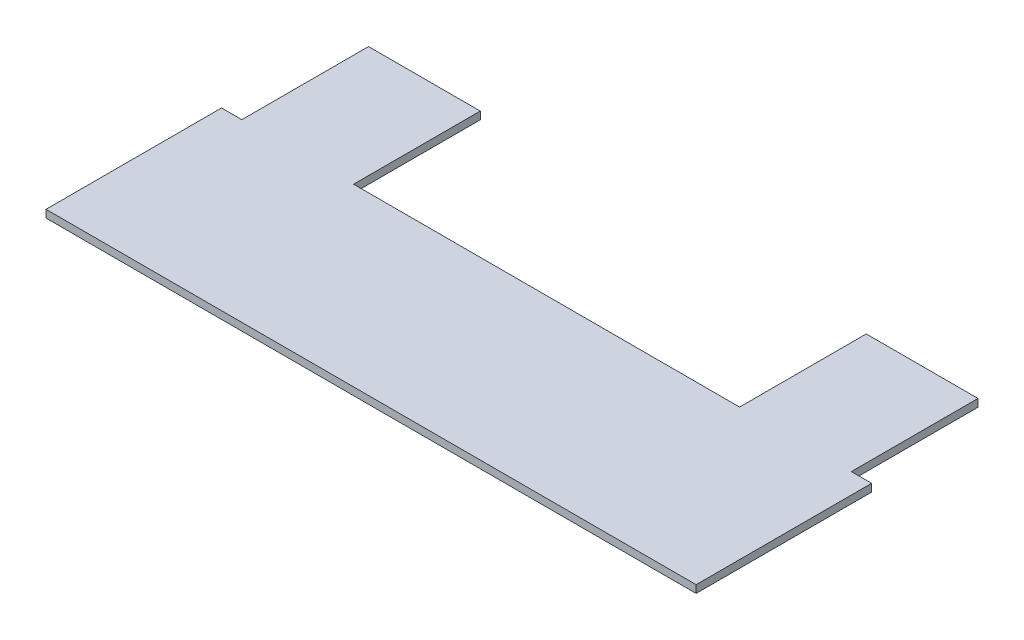
ISO-10303-21;
HEADER;
FILE_DESCRIPTION(('STEP AP214'),'2;1');
FILE_NAME('part.step','',(''),(''),'','','');
FILE_SCHEMA(('AUTOMOTIVE_DESIGN { 1 0 10303 214 1 1 1 1 }'));
ENDSEC;
DATA;
#1=APPLICATION_CONTEXT('core data for automotive mechanical design processes');
#2=APPLICATION_PROTOCOL_DEFINITION('international standard','automotive_design',2000,#1);
#3=PRODUCT_CONTEXT('',#1,'mechanical');
#4=PRODUCT('Part','Part','',(#3));
#5=PRODUCT_RELATED_PRODUCT_CATEGORY('part','',(#4));
#6=PRODUCT_DEFINITION_FORMATION('','',#4);
#7=PRODUCT_DEFINITION_CONTEXT('part definition',#1,'design');
#8=PRODUCT_DEFINITION('design','',#6,#7);
#9=PRODUCT_DEFINITION_SHAPE('','',#8);
#10=(LENGTH_UNIT() NAMED_UNIT(*) SI_UNIT(.MILLI.,.METRE.));
#11=(NAMED_UNIT(*) PLANE_ANGLE_UNIT() SI_UNIT($,.RADIAN.));
#12=(NAMED_UNIT(*) SI_UNIT($,.STERADIAN.) SOLID_ANGLE_UNIT());
#13=UNCERTAINTY_MEASURE_WITH_UNIT(LENGTH_MEASURE(1.E-05),#10,'distance_accuracy_value','');
#14=(GEOMETRIC_REPRESENTATION_CONTEXT(3) GLOBAL_UNCERTAINTY_ASSIGNED_CONTEXT((#13)) GLOBAL_UNIT_ASSIGNED_CONTEXT((#10,
#11,#12)) REPRESENTATION_CONTEXT('',''));
#15=CARTESIAN_POINT('',(0.,0.,0.));
#16=DIRECTION('',(0.,0.,1.));
#17=DIRECTION('',(1.,0.,0.));
#18=AXIS2_PLACEMENT_3D('',#15,#16,#17);
#19=CARTESIAN_POINT('',(-203.2,4.7625,-94.45625));
#20=DIRECTION('',(0.,0.,1.));
#21=DIRECTION('',(1.,0.,0.));
#22=AXIS2_PLACEMENT_3D('',#19,#20,#21);
#23=PLANE('',#22);
#24=DIRECTION('',(-1.,0.,0.));
#25=VECTOR('',#24,1.);
#26=CARTESIAN_POINT('',(-203.2,0.,-94.45625));
#27=LINE('',#26,#25);
#28=CARTESIAN_POINT('',(-120.65,0.,-94.45625));
#29=VERTEX_POINT('',#28);
#30=CARTESIAN_POINT('',(-190.5,0.,-94.45625));
#31=VERTEX_POINT('',#30);
#32=EDGE_CURVE('E239',#29,#31,#27,.T.);
#33=ORIENTED_EDGE('',*,*,#32,.T.);
#34=DIRECTION('',(0.,1.,0.));
#35=VECTOR('',#34,1.);
#36=CARTESIAN_POINT('',(-190.5,-253.959588890519,-94.45625));
#37=LINE('',#36,#35);
#38=CARTESIAN_POINT('',(-190.5,4.7625,-94.45625));
#39=VERTEX_POINT('',#38);
#40=EDGE_CURVE('E54',#31,#39,#37,.T.);
#41=ORIENTED_EDGE('',*,*,#40,.T.);
#42=DIRECTION('',(-1.,0.,0.));
#43=VECTOR('',#42,1.);
#44=CARTESIAN_POINT('',(-203.2,4.7625,-94.45625));
#45=LINE('',#44,#43);
#46=CARTESIAN_POINT('',(-120.65,4.7625,-94.45625));
#47=VERTEX_POINT('',#46);
#48=EDGE_CURVE('E224',#47,#39,#45,.T.);
#49=ORIENTED_EDGE('',*,*,#48,.F.);
#50=DIRECTION('',(0.,1.,0.));
#51=VECTOR('',#50,1.);
#52=CARTESIAN_POINT('',(-120.65,-253.959588890519,-94.45625));
#53=LINE('',#52,#51);
#54=EDGE_CURVE('E191',#29,#47,#53,.T.);
#55=ORIENTED_EDGE('',*,*,#54,.F.);
#56=EDGE_LOOP('',(#33,#41,#49,#55));
#57=FACE_BOUND('',#56,.T.);
#58=ADVANCED_FACE('F38',(#57),#23,.F.);
#59=CARTESIAN_POINT('',(203.2,4.7625,94.45625));
#60=DIRECTION('',(-1.,0.,0.));
#61=DIRECTION('',(0.,0.,1.));
#62=AXIS2_PLACEMENT_3D('',#59,#60,#61);
#63=PLANE('',#62);
#64=DIRECTION('',(0.,0.,-1.));
#65=VECTOR('',#64,1.);
#66=CARTESIAN_POINT('',(203.2,0.,94.45625));
#67=LINE('',#66,#65);
#68=CARTESIAN_POINT('',(203.2,0.,94.45625));
#69=VERTEX_POINT('',#68);
#70=CARTESIAN_POINT('',(203.2,0.,-15.27429));
#71=VERTEX_POINT('',#70);
#72=EDGE_CURVE('E161',#69,#71,#67,.T.);
#73=ORIENTED_EDGE('',*,*,#72,.T.);
#74=DIRECTION('',(0.,1.,0.));
#75=VECTOR('',#74,1.);
#76=CARTESIAN_POINT('',(203.2,-253.959588890519,-15.27429));
#77=LINE('',#76,#75);
#78=CARTESIAN_POINT('',(203.2,4.7625,-15.27429));
#79=VERTEX_POINT('',#78);
#80=EDGE_CURVE('E174',#71,#79,#77,.T.);
#81=ORIENTED_EDGE('',*,*,#80,.T.);
#82=DIRECTION('',(0.,0.,-1.));
#83=VECTOR('',#82,1.);
#84=CARTESIAN_POINT('',(203.2,4.7625,94.45625));
#85=LINE('',#84,#83);
#86=CARTESIAN_POINT('',(203.2,4.7625,94.45625));
#87=VERTEX_POINT('',#86);
#88=EDGE_CURVE('E220',#87,#79,#85,.T.);
#89=ORIENTED_EDGE('',*,*,#88,.F.);
#90=DIRECTION('',(0.,-1.,0.));
#91=VECTOR('',#90,1.);
#92=CARTESIAN_POINT('',(203.2,4.7625,94.45625));
#93=LINE('',#92,#91);
#94=EDGE_CURVE('E47',#87,#69,#93,.T.);
#95=ORIENTED_EDGE('',*,*,#94,.T.);
#96=EDGE_LOOP('',(#73,#81,#89,#95));
#97=FACE_BOUND('',#96,.T.);
#98=ADVANCED_FACE('F40',(#97),#63,.F.);
#99=CARTESIAN_POINT('',(190.5,4.7625,-94.45625));
#100=VERTEX_POINT('',#99);
#101=CARTESIAN_POINT('',(120.65,4.7625,-94.45625));
#102=VERTEX_POINT('',#101);
#103=EDGE_CURVE('E229',#100,#102,#45,.T.);
#104=ORIENTED_EDGE('',*,*,#103,.F.);
#105=DIRECTION('',(0.,1.,0.));
#106=VECTOR('',#105,1.);
#107=CARTESIAN_POINT('',(190.5,-253.959588890519,-94.45625));
#108=LINE('',#107,#106);
#109=CARTESIAN_POINT('',(190.5,0.,-94.45625));
#110=VERTEX_POINT('',#109);
#111=EDGE_CURVE('E165',#110,#100,#108,.T.);
#112=ORIENTED_EDGE('',*,*,#111,.F.);
#113=CARTESIAN_POINT('',(120.65,0.,-94.45625));
#114=VERTEX_POINT('',#113);
#115=EDGE_CURVE('E242',#110,#114,#27,.T.);
#116=ORIENTED_EDGE('',*,*,#115,.T.);
#117=DIRECTION('',(0.,1.,0.));
#118=VECTOR('',#117,1.);
#119=CARTESIAN_POINT('',(120.65,-253.959588890519,-94.45625));
#120=LINE('',#119,#118);
#121=EDGE_CURVE('E62',#114,#102,#120,.T.);
#122=ORIENTED_EDGE('',*,*,#121,.T.);
#123=EDGE_LOOP('',(#104,#112,#116,#122));
#124=FACE_BOUND('',#123,.T.);
#125=ADVANCED_FACE('F288',(#124),#23,.F.);
#126=CARTESIAN_POINT('',(-203.2,4.7625,94.45625));
#127=DIRECTION('',(1.,0.,0.));
#128=DIRECTION('',(0.,0.,-1.));
#129=AXIS2_PLACEMENT_3D('',#126,#127,#128);
#130=PLANE('',#129);
#131=DIRECTION('',(0.,0.,1.));
#132=VECTOR('',#131,1.);
#133=CARTESIAN_POINT('',(-203.2,4.7625,94.45625));
#134=LINE('',#133,#132);
#135=CARTESIAN_POINT('',(-203.2,4.7625,-15.27429));
#136=VERTEX_POINT('',#135);
#137=CARTESIAN_POINT('',(-203.2,4.7625,94.45625));
#138=VERTEX_POINT('',#137);
#139=EDGE_CURVE('E230',#136,#138,#134,.T.);
#140=ORIENTED_EDGE('',*,*,#139,.F.);
#141=DIRECTION('',(0.,1.,0.));
#142=VECTOR('',#141,1.);
#143=CARTESIAN_POINT('',(-203.2,-253.959588890519,-15.27429));
#144=LINE('',#143,#142);
#145=CARTESIAN_POINT('',(-203.2,0.,-15.27429));
#146=VERTEX_POINT('',#145);
#147=EDGE_CURVE('E157',#146,#136,#144,.T.);
#148=ORIENTED_EDGE('',*,*,#147,.F.);
#149=DIRECTION('',(0.,0.,1.));
#150=VECTOR('',#149,1.);
#151=CARTESIAN_POINT('',(-203.2,0.,94.45625));
#152=LINE('',#151,#150);
#153=CARTESIAN_POINT('',(-203.2,0.,94.45625));
#154=VERTEX_POINT('',#153);
#155=EDGE_CURVE('E148',#146,#154,#152,.T.);
#156=ORIENTED_EDGE('',*,*,#155,.T.);
#157=DIRECTION('',(0.,-1.,0.));
#158=VECTOR('',#157,1.);
#159=CARTESIAN_POINT('',(-203.2,4.7625,94.45625));
#160=LINE('',#159,#158);
#161=EDGE_CURVE('E11',#138,#154,#160,.T.);
#162=ORIENTED_EDGE('',*,*,#161,.F.);
#163=EDGE_LOOP('',(#140,#148,#156,#162));
#164=FACE_BOUND('',#163,.T.);
#165=ADVANCED_FACE('F271',(#164),#130,.F.);
#166=CARTESIAN_POINT('',(-203.2,4.7625,94.45625));
#167=DIRECTION('',(0.,0.,-1.));
#168=DIRECTION('',(-1.,0.,0.));
#169=AXIS2_PLACEMENT_3D('',#166,#167,#168);
#170=PLANE('',#169);
#171=DIRECTION('',(1.,0.,0.));
#172=VECTOR('',#171,1.);
#173=CARTESIAN_POINT('',(-203.2,0.,94.45625));
#174=LINE('',#173,#172);
#175=EDGE_CURVE('E225',#154,#69,#174,.T.);
#176=ORIENTED_EDGE('',*,*,#175,.T.);
#177=ORIENTED_EDGE('',*,*,#94,.F.);
#178=DIRECTION('',(1.,0.,0.));
#179=VECTOR('',#178,1.);
#180=CARTESIAN_POINT('',(-203.2,4.7625,94.45625));
#181=LINE('',#180,#179);
#182=EDGE_CURVE('E233',#138,#87,#181,.T.);
#183=ORIENTED_EDGE('',*,*,#182,.F.);
#184=ORIENTED_EDGE('',*,*,#161,.T.);
#185=EDGE_LOOP('',(#176,#177,#183,#184));
#186=FACE_BOUND('',#185,.T.);
#187=ADVANCED_FACE('F269',(#186),#170,.F.);
#188=CARTESIAN_POINT('',(0.,4.7625,0.));
#189=DIRECTION('',(0.,-1.,0.));
#190=DIRECTION('',(0.,0.,-1.));
#191=AXIS2_PLACEMENT_3D('',#188,#189,#190);
#192=PLANE('',#191);
#193=DIRECTION('',(0.,0.,-1.));
#194=VECTOR('',#193,1.);
#195=CARTESIAN_POINT('',(-190.5,4.7625,-94.45625));
#196=LINE('',#195,#194);
#197=CARTESIAN_POINT('',(-190.5,4.7625,-15.27429));
#198=VERTEX_POINT('',#197);
#199=EDGE_CURVE('E150',#198,#39,#196,.T.);
#200=ORIENTED_EDGE('',*,*,#199,.F.);
#201=DIRECTION('',(1.,0.,0.));
#202=VECTOR('',#201,1.);
#203=CARTESIAN_POINT('',(-203.2,4.7625,-15.27429));
#204=LINE('',#203,#202);
#205=EDGE_CURVE('E141',#136,#198,#204,.T.);
#206=ORIENTED_EDGE('',*,*,#205,.F.);
#207=ORIENTED_EDGE('',*,*,#139,.T.);
#208=ORIENTED_EDGE('',*,*,#182,.T.);
#209=ORIENTED_EDGE('',*,*,#88,.T.);
#210=DIRECTION('',(1.,0.,0.));
#211=VECTOR('',#210,1.);
#212=CARTESIAN_POINT('',(203.2,4.7625,-15.27429));
#213=LINE('',#212,#211);
#214=CARTESIAN_POINT('',(190.5,4.7625,-15.27429));
#215=VERTEX_POINT('',#214);
#216=EDGE_CURVE('E162',#215,#79,#213,.T.);
#217=ORIENTED_EDGE('',*,*,#216,.F.);
#218=DIRECTION('',(0.,0.,1.));
#219=VECTOR('',#218,1.);
#220=CARTESIAN_POINT('',(190.5,4.7625,-94.45625));
#221=LINE('',#220,#219);
#222=EDGE_CURVE('E166',#100,#215,#221,.T.);
#223=ORIENTED_EDGE('',*,*,#222,.F.);
#224=ORIENTED_EDGE('',*,*,#103,.T.);
#225=DIRECTION('',(0.,0.,-1.));
#226=VECTOR('',#225,1.);
#227=CARTESIAN_POINT('',(120.65,4.7625,-15.27429));
#228=LINE('',#227,#226);
#229=CARTESIAN_POINT('',(120.65,4.7625,-15.27429));
#230=VERTEX_POINT('',#229);
#231=EDGE_CURVE('E196',#230,#102,#228,.T.);
#232=ORIENTED_EDGE('',*,*,#231,.F.);
#233=DIRECTION('',(1.,0.,0.));
#234=VECTOR('',#233,1.);
#235=CARTESIAN_POINT('',(-120.65,4.7625,-15.27429));
#236=LINE('',#235,#234);
#237=CARTESIAN_POINT('',(-120.65,4.7625,-15.27429));
#238=VERTEX_POINT('',#237);
#239=EDGE_CURVE('E187',#238,#230,#236,.T.);
#240=ORIENTED_EDGE('',*,*,#239,.F.);
#241=DIRECTION('',(0.,0.,1.));
#242=VECTOR('',#241,1.);
#243=CARTESIAN_POINT('',(-120.65,4.7625,-15.27429));
#244=LINE('',#243,#242);
#245=EDGE_CURVE('E192',#47,#238,#244,.T.);
#246=ORIENTED_EDGE('',*,*,#245,.F.);
#247=ORIENTED_EDGE('',*,*,#48,.T.);
#248=EDGE_LOOP('',(#200,#206,#207,#208,#209,#217,#223,#224,#232,#240,#246,#247));
#249=FACE_BOUND('',#248,.T.);
#250=ADVANCED_FACE('F266',(#249),#192,.F.);
#251=CARTESIAN_POINT('',(0.,0.,0.));
#252=DIRECTION('',(0.,-1.,0.));
#253=DIRECTION('',(0.,0.,-1.));
#254=AXIS2_PLACEMENT_3D('',#251,#252,#253);
#255=PLANE('',#254);
#256=DIRECTION('',(1.,0.,0.));
#257=VECTOR('',#256,1.);
#258=CARTESIAN_POINT('',(-203.2,0.,-15.27429));
#259=LINE('',#258,#257);
#260=CARTESIAN_POINT('',(-190.5,0.,-15.27429));
#261=VERTEX_POINT('',#260);
#262=EDGE_CURVE('E138',#146,#261,#259,.T.);
#263=ORIENTED_EDGE('',*,*,#262,.T.);
#264=DIRECTION('',(0.,0.,-1.));
#265=VECTOR('',#264,1.);
#266=CARTESIAN_POINT('',(-190.5,0.,-94.45625));
#267=LINE('',#266,#265);
#268=EDGE_CURVE('E125',#261,#31,#267,.T.);
#269=ORIENTED_EDGE('',*,*,#268,.T.);
#270=ORIENTED_EDGE('',*,*,#32,.F.);
#271=DIRECTION('',(0.,0.,1.));
#272=VECTOR('',#271,1.);
#273=CARTESIAN_POINT('',(-120.65,0.,-15.27429));
#274=LINE('',#273,#272);
#275=CARTESIAN_POINT('',(-120.65,0.,-15.27429));
#276=VERTEX_POINT('',#275);
#277=EDGE_CURVE('E208',#29,#276,#274,.T.);
#278=ORIENTED_EDGE('',*,*,#277,.T.);
#279=DIRECTION('',(1.,0.,0.));
#280=VECTOR('',#279,1.);
#281=CARTESIAN_POINT('',(-120.65,0.,-15.27429));
#282=LINE('',#281,#280);
#283=CARTESIAN_POINT('',(120.65,0.,-15.27429));
#284=VERTEX_POINT('',#283);
#285=EDGE_CURVE('E203',#276,#284,#282,.T.);
#286=ORIENTED_EDGE('',*,*,#285,.T.);
#287=DIRECTION('',(0.,0.,-1.));
#288=VECTOR('',#287,1.);
#289=CARTESIAN_POINT('',(120.65,0.,-15.27429));
#290=LINE('',#289,#288);
#291=EDGE_CURVE('E199',#284,#114,#290,.T.);
#292=ORIENTED_EDGE('',*,*,#291,.T.);
#293=ORIENTED_EDGE('',*,*,#115,.F.);
#294=DIRECTION('',(0.,0.,1.));
#295=VECTOR('',#294,1.);
#296=CARTESIAN_POINT('',(190.5,0.,-94.45625));
#297=LINE('',#296,#295);
#298=CARTESIAN_POINT('',(190.5,0.,-15.27429));
#299=VERTEX_POINT('',#298);
#300=EDGE_CURVE('E176',#110,#299,#297,.T.);
#301=ORIENTED_EDGE('',*,*,#300,.T.);
#302=DIRECTION('',(1.,0.,0.));
#303=VECTOR('',#302,1.);
#304=CARTESIAN_POINT('',(203.2,0.,-15.27429));
#305=LINE('',#304,#303);
#306=EDGE_CURVE('E170',#299,#71,#305,.T.);
#307=ORIENTED_EDGE('',*,*,#306,.T.);
#308=ORIENTED_EDGE('',*,*,#72,.F.);
#309=ORIENTED_EDGE('',*,*,#175,.F.);
#310=ORIENTED_EDGE('',*,*,#155,.F.);
#311=EDGE_LOOP('',(#263,#269,#270,#278,#286,#292,#293,#301,#307,#308,#309,#310));
#312=FACE_BOUND('',#311,.T.);
#313=ADVANCED_FACE('F146',(#312),#255,.T.);
#314=CARTESIAN_POINT('',(-120.65,-253.959588890519,-15.27429));
#315=DIRECTION('',(-1.,0.,0.));
#316=DIRECTION('',(0.,0.,1.));
#317=AXIS2_PLACEMENT_3D('',#314,#315,#316);
#318=PLANE('',#317);
#319=ORIENTED_EDGE('',*,*,#54,.T.);
#320=ORIENTED_EDGE('',*,*,#245,.T.);
#321=DIRECTION('',(0.,1.,0.));
#322=VECTOR('',#321,1.);
#323=CARTESIAN_POINT('',(-120.65,-253.959588890519,-15.27429));
#324=LINE('',#323,#322);
#325=EDGE_CURVE('E207',#276,#238,#324,.T.);
#326=ORIENTED_EDGE('',*,*,#325,.F.);
#327=ORIENTED_EDGE('',*,*,#277,.F.);
#328=EDGE_LOOP('',(#319,#320,#326,#327));
#329=FACE_BOUND('',#328,.T.);
#330=ADVANCED_FACE('F279',(#329),#318,.F.);
#331=CARTESIAN_POINT('',(-120.65,-253.959588890519,-15.27429));
#332=DIRECTION('',(0.,0.,1.));
#333=DIRECTION('',(1.,0.,0.));
#334=AXIS2_PLACEMENT_3D('',#331,#332,#333);
#335=PLANE('',#334);
#336=ORIENTED_EDGE('',*,*,#325,.T.);
#337=ORIENTED_EDGE('',*,*,#239,.T.);
#338=DIRECTION('',(0.,1.,0.));
#339=VECTOR('',#338,1.);
#340=CARTESIAN_POINT('',(120.65,-253.959588890519,-15.27429));
#341=LINE('',#340,#339);
#342=EDGE_CURVE('E202',#284,#230,#341,.T.);
#343=ORIENTED_EDGE('',*,*,#342,.F.);
#344=ORIENTED_EDGE('',*,*,#285,.F.);
#345=EDGE_LOOP('',(#336,#337,#343,#344));
#346=FACE_BOUND('',#345,.T.);
#347=ADVANCED_FACE('F282',(#346),#335,.F.);
#348=CARTESIAN_POINT('',(120.65,-253.959588890519,-15.27429));
#349=DIRECTION('',(1.,0.,0.));
#350=DIRECTION('',(0.,0.,-1.));
#351=AXIS2_PLACEMENT_3D('',#348,#349,#350);
#352=PLANE('',#351);
#353=ORIENTED_EDGE('',*,*,#342,.T.);
#354=ORIENTED_EDGE('',*,*,#231,.T.);
#355=ORIENTED_EDGE('',*,*,#121,.F.);
#356=ORIENTED_EDGE('',*,*,#291,.F.);
#357=EDGE_LOOP('',(#353,#354,#355,#356));
#358=FACE_BOUND('',#357,.T.);
#359=ADVANCED_FACE('F285',(#358),#352,.F.);
#360=CARTESIAN_POINT('',(190.5,-253.959588890519,-94.45625));
#361=DIRECTION('',(-1.,0.,0.));
#362=DIRECTION('',(0.,0.,1.));
#363=AXIS2_PLACEMENT_3D('',#360,#361,#362);
#364=PLANE('',#363);
#365=ORIENTED_EDGE('',*,*,#111,.T.);
#366=ORIENTED_EDGE('',*,*,#222,.T.);
#367=DIRECTION('',(0.,1.,0.));
#368=VECTOR('',#367,1.);
#369=CARTESIAN_POINT('',(190.5,-253.959588890519,-15.27429));
#370=LINE('',#369,#368);
#371=EDGE_CURVE('E175',#299,#215,#370,.T.);
#372=ORIENTED_EDGE('',*,*,#371,.F.);
#373=ORIENTED_EDGE('',*,*,#300,.F.);
#374=EDGE_LOOP('',(#365,#366,#372,#373));
#375=FACE_BOUND('',#374,.T.);
#376=ADVANCED_FACE('F259',(#375),#364,.F.);
#377=CARTESIAN_POINT('',(203.2,-253.959588890519,-15.27429));
#378=DIRECTION('',(0.,0.,1.));
#379=DIRECTION('',(1.,0.,0.));
#380=AXIS2_PLACEMENT_3D('',#377,#378,#379);
#381=PLANE('',#380);
#382=ORIENTED_EDGE('',*,*,#371,.T.);
#383=ORIENTED_EDGE('',*,*,#216,.T.);
#384=ORIENTED_EDGE('',*,*,#80,.F.);
#385=ORIENTED_EDGE('',*,*,#306,.F.);
#386=EDGE_LOOP('',(#382,#383,#384,#385));
#387=FACE_BOUND('',#386,.T.);
#388=ADVANCED_FACE('F257',(#387),#381,.F.);
#389=CARTESIAN_POINT('',(-203.2,-253.959588890519,-15.27429));
#390=DIRECTION('',(0.,0.,1.));
#391=DIRECTION('',(1.,0.,0.));
#392=AXIS2_PLACEMENT_3D('',#389,#390,#391);
#393=PLANE('',#392);
#394=ORIENTED_EDGE('',*,*,#147,.T.);
#395=ORIENTED_EDGE('',*,*,#205,.T.);
#396=DIRECTION('',(0.,1.,0.));
#397=VECTOR('',#396,1.);
#398=CARTESIAN_POINT('',(-190.5,-253.959588890519,-15.27429));
#399=LINE('',#398,#397);
#400=EDGE_CURVE('E128',#261,#198,#399,.T.);
#401=ORIENTED_EDGE('',*,*,#400,.F.);
#402=ORIENTED_EDGE('',*,*,#262,.F.);
#403=EDGE_LOOP('',(#394,#395,#401,#402));
#404=FACE_BOUND('',#403,.T.);
#405=ADVANCED_FACE('F137',(#404),#393,.F.);
#406=CARTESIAN_POINT('',(-190.5,-253.959588890519,-94.45625));
#407=DIRECTION('',(1.,0.,0.));
#408=DIRECTION('',(0.,0.,-1.));
#409=AXIS2_PLACEMENT_3D('',#406,#407,#408);
#410=PLANE('',#409);
#411=ORIENTED_EDGE('',*,*,#400,.T.);
#412=ORIENTED_EDGE('',*,*,#199,.T.);
#413=ORIENTED_EDGE('',*,*,#40,.F.);
#414=ORIENTED_EDGE('',*,*,#268,.F.);
#415=EDGE_LOOP('',(#411,#412,#413,#414));
#416=FACE_BOUND('',#415,.T.);
#417=ADVANCED_FACE('F127',(#416),#410,.F.);
#418=CLOSED_SHELL('',(#58,#98,#125,#165,#187,#250,#313,#330,#347,#359,#376,#388,#405,#417));
#419=MANIFOLD_SOLID_BREP('B2',#418);
#420=ADVANCED_BREP_SHAPE_REPRESENTATION('',(#18,#419),#14);
#421=SHAPE_DEFINITION_REPRESENTATION(#9,#420);
ENDSEC;
END-ISO-10303-21;
